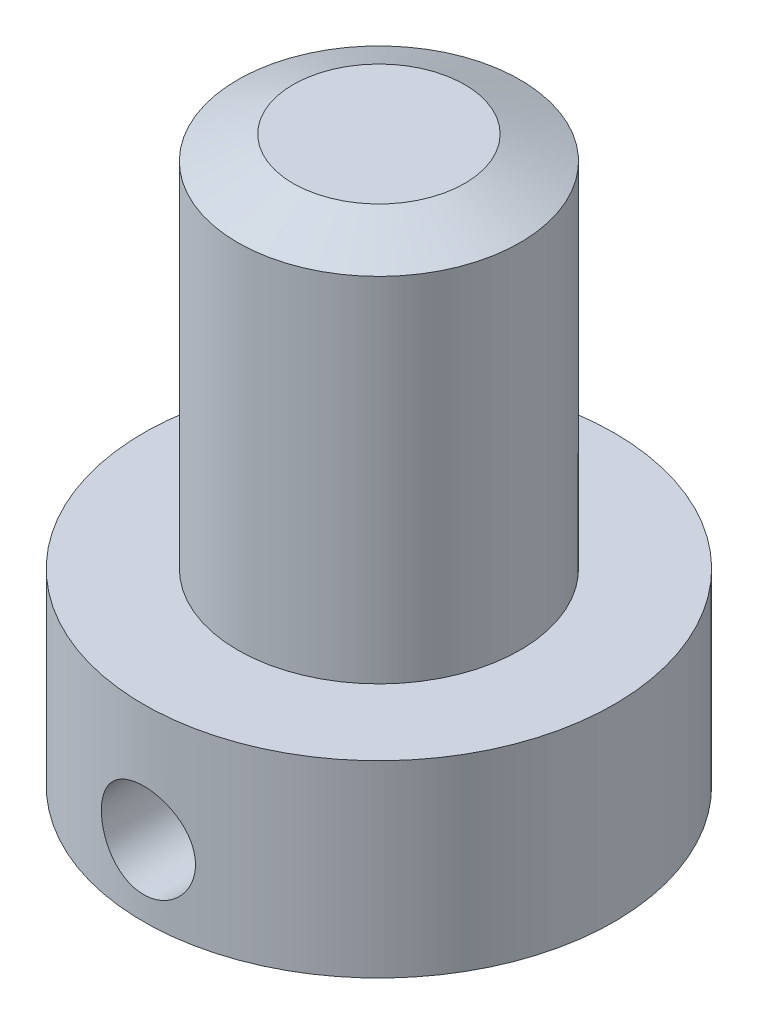
ISO-10303-21;
HEADER;
FILE_DESCRIPTION(('STEP AP214'),'2;1');
FILE_NAME('part.step','',(''),(''),'','','');
FILE_SCHEMA(('AUTOMOTIVE_DESIGN { 1 0 10303 214 1 1 1 1 }'));
ENDSEC;
DATA;
#1=APPLICATION_CONTEXT('core data for automotive mechanical design processes');
#2=APPLICATION_PROTOCOL_DEFINITION('international standard','automotive_design',2000,#1);
#3=PRODUCT_CONTEXT('',#1,'mechanical');
#4=PRODUCT('Part','Part','',(#3));
#5=PRODUCT_RELATED_PRODUCT_CATEGORY('part','',(#4));
#6=PRODUCT_DEFINITION_FORMATION('','',#4);
#7=PRODUCT_DEFINITION_CONTEXT('part definition',#1,'design');
#8=PRODUCT_DEFINITION('design','',#6,#7);
#9=PRODUCT_DEFINITION_SHAPE('','',#8);
#10=(LENGTH_UNIT() NAMED_UNIT(*) SI_UNIT(.MILLI.,.METRE.));
#11=(NAMED_UNIT(*) PLANE_ANGLE_UNIT() SI_UNIT($,.RADIAN.));
#12=(NAMED_UNIT(*) SI_UNIT($,.STERADIAN.) SOLID_ANGLE_UNIT());
#13=UNCERTAINTY_MEASURE_WITH_UNIT(LENGTH_MEASURE(1.E-05),#10,'distance_accuracy_value','');
#14=(GEOMETRIC_REPRESENTATION_CONTEXT(3) GLOBAL_UNCERTAINTY_ASSIGNED_CONTEXT((#13)) GLOBAL_UNIT_ASSIGNED_CONTEXT((#10,
#11,#12)) REPRESENTATION_CONTEXT('',''));
#15=CARTESIAN_POINT('',(0.,0.,0.));
#16=DIRECTION('',(0.,0.,1.));
#17=DIRECTION('',(1.,0.,0.));
#18=AXIS2_PLACEMENT_3D('',#15,#16,#17);
#19=CARTESIAN_POINT('',(0.,8.,0.));
#20=DIRECTION('',(0.,-1.,0.));
#21=DIRECTION('',(0.,0.,-1.));
#22=AXIS2_PLACEMENT_3D('',#19,#20,#21);
#23=CYLINDRICAL_SURFACE('',#22,3.);
#24=CARTESIAN_POINT('',(0.,7.5,0.));
#25=DIRECTION('',(0.,1.,0.));
#26=DIRECTION('',(0.,0.,1.));
#27=AXIS2_PLACEMENT_3D('',#24,#25,#26);
#28=CIRCLE('',#27,3.);
#29=CARTESIAN_POINT('',(0.,7.5,3.));
#30=VERTEX_POINT('',#29);
#31=EDGE_CURVE('E10',#30,#30,#28,.F.);
#32=ORIENTED_EDGE('',*,*,#31,.T.);
#33=EDGE_LOOP('',(#32));
#34=FACE_BOUND('',#33,.T.);
#35=CARTESIAN_POINT('',(0.,0.,0.));
#36=DIRECTION('',(0.,1.,0.));
#37=DIRECTION('',(0.,0.,1.));
#38=AXIS2_PLACEMENT_3D('',#35,#36,#37);
#39=CIRCLE('',#38,3.);
#40=CARTESIAN_POINT('',(0.,0.,3.));
#41=VERTEX_POINT('',#40);
#42=EDGE_CURVE('E119',#41,#41,#39,.T.);
#43=ORIENTED_EDGE('',*,*,#42,.T.);
#44=EDGE_LOOP('',(#43));
#45=FACE_BOUND('',#44,.T.);
#46=ADVANCED_FACE('F34',(#34,#45),#23,.T.);
#47=CARTESIAN_POINT('',(0.,8.,0.));
#48=DIRECTION('',(0.,1.,0.));
#49=DIRECTION('',(0.,0.,1.));
#50=AXIS2_PLACEMENT_3D('',#47,#48,#49);
#51=PLANE('',#50);
#52=CARTESIAN_POINT('',(0.,8.,0.));
#53=DIRECTION('',(0.,1.,0.));
#54=DIRECTION('',(0.,0.,1.));
#55=AXIS2_PLACEMENT_3D('',#52,#53,#54);
#56=CIRCLE('',#55,1.82207381708812);
#57=CARTESIAN_POINT('',(0.,8.,1.82207381708812));
#58=VERTEX_POINT('',#57);
#59=EDGE_CURVE('E45',#58,#58,#56,.T.);
#60=ORIENTED_EDGE('',*,*,#59,.T.);
#61=EDGE_LOOP('',(#60));
#62=FACE_BOUND('',#61,.T.);
#63=ADVANCED_FACE('F89',(#62),#51,.T.);
#64=CARTESIAN_POINT('',(0.,-5.,0.));
#65=DIRECTION('',(0.,1.,0.));
#66=DIRECTION('',(0.,0.,1.));
#67=AXIS2_PLACEMENT_3D('',#64,#65,#66);
#68=CYLINDRICAL_SURFACE('',#67,5.);
#69=CARTESIAN_POINT('',(0.,-4.,0.));
#70=DIRECTION('',(0.,-1.,0.));
#71=DIRECTION('',(0.,0.,-1.));
#72=AXIS2_PLACEMENT_3D('',#69,#70,#71);
#73=CIRCLE('',#72,5.);
#74=CARTESIAN_POINT('',(0.,-4.,-5.));
#75=VERTEX_POINT('',#74);
#76=EDGE_CURVE('E46',#75,#75,#73,.F.);
#77=ORIENTED_EDGE('',*,*,#76,.T.);
#78=EDGE_LOOP('',(#77));
#79=FACE_BOUND('',#78,.T.);
#80=CARTESIAN_POINT('',(0.,-1.5,-5.));
#81=CARTESIAN_POINT('',(-0.0555769067926332,-1.50000204449835,-4.99999897580871));
#82=CARTESIAN_POINT('',(-0.111179660201522,-1.50464884296765,-4.99906385178231));
#83=CARTESIAN_POINT('',(-0.220813507689019,-1.52309850011525,-4.99542365623231));
#84=CARTESIAN_POINT('',(-0.274843317541356,-1.53690863280151,-4.99271717860186));
#85=CARTESIAN_POINT('',(-0.379730305263313,-1.57324127362079,-4.98583649278287));
#86=CARTESIAN_POINT('',(-0.430590467933134,-1.59575543684469,-4.98166369076718));
#87=CARTESIAN_POINT('',(-0.527807988864225,-1.64883224751129,-4.97230398035314));
#88=CARTESIAN_POINT('',(-0.574165615075812,-1.67939441560721,-4.96711713235707));
#89=CARTESIAN_POINT('',(-0.661693477314865,-1.74813849429143,-4.9562216532997));
#90=CARTESIAN_POINT('',(-0.702793951158524,-1.7864083553912,-4.95050745504347));
#91=CARTESIAN_POINT('',(-0.778036756608028,-1.8692924163917,-4.93924180452588));
#92=CARTESIAN_POINT('',(-0.812178544770425,-1.91390711133512,-4.93369036500424));
#93=CARTESIAN_POINT('',(-0.87283175334762,-2.00871619301188,-4.92332441812615));
#94=CARTESIAN_POINT('',(-0.899270938865866,-2.05895764379636,-4.91851707364946));
#95=CARTESIAN_POINT('',(-0.943305666580308,-2.16328181900408,-4.91026268058418));
#96=CARTESIAN_POINT('',(-0.960902082437238,-2.21736416334634,-4.90681549761962));
#97=CARTESIAN_POINT('',(-0.986525299884827,-2.32708436390792,-4.90172805252204));
#98=CARTESIAN_POINT('',(-0.994674497958777,-2.38269254414223,-4.90006470107188));
#99=CARTESIAN_POINT('',(-1.00155212772612,-2.49450982136434,-4.89866375060627));
#100=CARTESIAN_POINT('',(-1.0002815227135,-2.55071885632014,-4.89892595467841));
#101=CARTESIAN_POINT('',(-0.988454573101819,-2.661246788021,-4.90132551148185));
#102=CARTESIAN_POINT('',(-0.978038540243905,-2.71558140562731,-4.90343452858763));
#103=CARTESIAN_POINT('',(-0.94843788462305,-2.821716076663,-4.90924546160001));
#104=CARTESIAN_POINT('',(-0.929252843100681,-2.87351600891901,-4.91294745357779));
#105=CARTESIAN_POINT('',(-0.88252478367472,-2.9735152617036,-4.92155618500408));
#106=CARTESIAN_POINT('',(-0.854926151232115,-3.02168787956917,-4.92647089813704));
#107=CARTESIAN_POINT('',(-0.792193574572679,-3.11277084997281,-4.93694618773062));
#108=CARTESIAN_POINT('',(-0.757058764356829,-3.15568059685116,-4.94250683838366));
#109=CARTESIAN_POINT('',(-0.679499934560584,-3.23582940245694,-4.95377021241462));
#110=CARTESIAN_POINT('',(-0.636956161212445,-3.27295256785913,-4.95947369210905));
#111=CARTESIAN_POINT('',(-0.54618502406201,-3.33955384630122,-4.97028848714408));
#112=CARTESIAN_POINT('',(-0.497957587379389,-3.36903186129358,-4.97539979488974));
#113=CARTESIAN_POINT('',(-0.397059386878921,-3.41952750922597,-4.98446690160887));
#114=CARTESIAN_POINT('',(-0.3443818195853,-3.44053189364454,-4.98842088848272));
#115=CARTESIAN_POINT('',(-0.236148976448665,-3.47336047403857,-4.99471408987858));
#116=CARTESIAN_POINT('',(-0.180594050072449,-3.48518578207363,-4.99705350000531));
#117=CARTESIAN_POINT('',(-0.0691794056271502,-3.49915645379428,-4.99982671866868));
#118=CARTESIAN_POINT('',(-0.0133403283255759,-3.50146041954027,-5.0002917465247));
#119=CARTESIAN_POINT('',(0.0979249341927142,-3.49675014105782,-4.99935051930103));
#120=CARTESIAN_POINT('',(0.153351142443793,-3.4897364206474,-4.99794436941446));
#121=CARTESIAN_POINT('',(0.261705659946541,-3.46672162645604,-4.99343832008018));
#122=CARTESIAN_POINT('',(0.314651948339903,-3.4508019315021,-4.99035376404206));
#123=CARTESIAN_POINT('',(0.417123627499667,-3.41051601734419,-4.98283552061033));
#124=CARTESIAN_POINT('',(0.466648761637539,-3.38614916532317,-4.97840173214227));
#125=CARTESIAN_POINT('',(0.561541173686217,-3.32931750934869,-4.96859911533294));
#126=CARTESIAN_POINT('',(0.606850126752188,-3.29675721896105,-4.96321950437052));
#127=CARTESIAN_POINT('',(0.691418019119207,-3.22459080879272,-4.95214734829882));
#128=CARTESIAN_POINT('',(0.730676308930762,-3.18498393360013,-4.94645476968388));
#129=CARTESIAN_POINT('',(0.802640590774176,-3.09912664810888,-4.93529303556965));
#130=CARTESIAN_POINT('',(0.835237702448655,-3.05278425577866,-4.92982860233304));
#131=CARTESIAN_POINT('',(0.892185420051205,-2.95518863864332,-4.91984191796194));
#132=CARTESIAN_POINT('',(0.916536355922903,-2.90393561042645,-4.91531962913342));
#133=CARTESIAN_POINT('',(0.95615184158196,-2.79823175385045,-4.90776740584383));
#134=CARTESIAN_POINT('',(0.971463499791051,-2.74379915878968,-4.90472974872187));
#135=CARTESIAN_POINT('',(0.992708651627196,-2.6330665465091,-4.90047436792025));
#136=CARTESIAN_POINT('',(0.998643368225112,-2.57676677379065,-4.89925640691111));
#137=CARTESIAN_POINT('',(1.00092091086747,-2.46499113545568,-4.89879149631379));
#138=CARTESIAN_POINT('',(0.997435788070896,-2.40951885107299,-4.89950919189301));
#139=CARTESIAN_POINT('',(0.981352304100061,-2.29996835009497,-4.90275573484614));
#140=CARTESIAN_POINT('',(0.968754016129298,-2.2458901223052,-4.90528456767169));
#141=CARTESIAN_POINT('',(0.934878568498954,-2.14077228875946,-4.91185264219159));
#142=CARTESIAN_POINT('',(0.913622506717345,-2.08972563949758,-4.91588821018831));
#143=CARTESIAN_POINT('',(0.863054644601604,-1.99189627926556,-4.9250171497417));
#144=CARTESIAN_POINT('',(0.833742168774882,-1.94511392627486,-4.93011060998894));
#145=CARTESIAN_POINT('',(0.767305914786414,-1.85628442784969,-4.94088960523225));
#146=CARTESIAN_POINT('',(0.73005788723518,-1.8143312347324,-4.94658372909699));
#147=CARTESIAN_POINT('',(0.64906436901314,-1.73721379447083,-4.95786081871955));
#148=CARTESIAN_POINT('',(0.605317387153335,-1.70205110968273,-4.96344375863184));
#149=CARTESIAN_POINT('',(0.512017629088246,-1.63916535605355,-4.97393832387971));
#150=CARTESIAN_POINT('',(0.462408884429835,-1.61152399671997,-4.97884231219246));
#151=CARTESIAN_POINT('',(0.359166360940732,-1.56501387740341,-4.98735125085));
#152=CARTESIAN_POINT('',(0.305536260863126,-1.54613721046751,-4.99095737138616));
#153=CARTESIAN_POINT('',(0.209821488923779,-1.52134805195528,-4.99576372595371));
#154=CARTESIAN_POINT('',(0.168281664013784,-1.51335680629224,-4.99734303158452));
#155=CARTESIAN_POINT('',(0.0844995252100668,-1.50268208764164,-4.99946154139893));
#156=CARTESIAN_POINT('',(0.0422572337486189,-1.49999844549023,-5.00000077873155));
#157=CARTESIAN_POINT('',(0.,-1.5,-5.));
#158=B_SPLINE_CURVE_WITH_KNOTS('',3,(#80,#81,#82,#83,#84,#85,#86,#87,#88,#89,#90,#91,#92,#93,
#94,#95,#96,#97,#98,#99,#100,#101,#102,#103,#104,#105,#106,#107,#108,#109,#110,#111,#112,#113,
#114,#115,#116,#117,#118,#119,#120,#121,#122,#123,#124,#125,#126,#127,#128,#129,#130,#131,#132,
#133,#134,#135,#136,#137,#138,#139,#140,#141,#142,#143,#144,#145,#146,#147,#148,#149,#150,#151,
#152,#153,#154,#155,#156,#157),.UNSPECIFIED.,.T.,.F.,(4,2,2,2,2,2,2,2,2,2,2,2,2,2,2,2,2,2,2,2,2,
2,2,2,2,2,2,2,2,2,2,2,2,2,2,2,2,2,4),(0.,0.166576130661258,0.333284650691323,0.499833735250341,
0.666372902230863,0.834932670112186,1.00350559674737,1.17361195005923,1.34370149365197,
1.51156185103587,1.67940504281225,1.84471727006278,2.0100373925373,2.17647490203593,
2.3429315474967,2.51238252491351,2.6818356753982,2.85155274854024,3.02124925698036,
3.18810735676265,3.35495607657868,3.52030453950723,3.68566539216022,3.85305066033359,
4.0204538834593,4.19040628579226,4.36035188723466,4.52940381032723,4.69843368330415,
4.86439722567701,5.03035943492608,5.1959196125311,5.36149367581867,5.52988076239143,
5.6983065453293,5.86849496675637,6.03852955517519,6.16518775289894,6.29184191370996),.UNSPECIFIED.);
#159=CARTESIAN_POINT('',(0.,-1.5,-5.));
#160=VERTEX_POINT('',#159);
#161=EDGE_CURVE('E54',#160,#160,#158,.T.);
#162=ORIENTED_EDGE('',*,*,#161,.T.);
#163=EDGE_LOOP('',(#162));
#164=FACE_BOUND('',#163,.T.);
#165=CARTESIAN_POINT('',(0.,-3.5,5.));
#166=CARTESIAN_POINT('',(-0.0555769067926332,-3.49999795550165,4.99999897580871));
#167=CARTESIAN_POINT('',(-0.111179660201522,-3.49535115703235,4.99906385178231));
#168=CARTESIAN_POINT('',(-0.220813507689019,-3.47690149988475,4.99542365623231));
#169=CARTESIAN_POINT('',(-0.274843317541356,-3.46309136719849,4.99271717860186));
#170=CARTESIAN_POINT('',(-0.379730305263313,-3.42675872637921,4.98583649278287));
#171=CARTESIAN_POINT('',(-0.430590467933134,-3.40424456315531,4.98166369076718));
#172=CARTESIAN_POINT('',(-0.527807988864225,-3.35116775248871,4.97230398035314));
#173=CARTESIAN_POINT('',(-0.574165615075812,-3.3206055843928,4.96711713235707));
#174=CARTESIAN_POINT('',(-0.661693477314865,-3.25186150570857,4.9562216532997));
#175=CARTESIAN_POINT('',(-0.702793951158524,-3.2135916446088,4.95050745504347));
#176=CARTESIAN_POINT('',(-0.778036756608028,-3.1307075836083,4.93924180452588));
#177=CARTESIAN_POINT('',(-0.812178544770424,-3.08609288866488,4.93369036500424));
#178=CARTESIAN_POINT('',(-0.87283175334762,-2.99128380698813,4.92332441812615));
#179=CARTESIAN_POINT('',(-0.899270938865866,-2.94104235620364,4.91851707364946));
#180=CARTESIAN_POINT('',(-0.943305666580308,-2.83671818099592,4.91026268058418));
#181=CARTESIAN_POINT('',(-0.960902082437238,-2.78263583665366,4.90681549761962));
#182=CARTESIAN_POINT('',(-0.986525299884827,-2.67291563609208,4.90172805252204));
#183=CARTESIAN_POINT('',(-0.994674497958777,-2.61730745585777,4.90006470107188));
#184=CARTESIAN_POINT('',(-1.00155212772612,-2.50549017863566,4.89866375060627));
#185=CARTESIAN_POINT('',(-1.0002815227135,-2.44928114367986,4.89892595467841));
#186=CARTESIAN_POINT('',(-0.988454573101819,-2.338753211979,4.90132551148185));
#187=CARTESIAN_POINT('',(-0.978038540243905,-2.28441859437269,4.90343452858763));
#188=CARTESIAN_POINT('',(-0.948437884623051,-2.178283923337,4.90924546160001));
#189=CARTESIAN_POINT('',(-0.929252843100681,-2.12648399108099,4.91294745357779));
#190=CARTESIAN_POINT('',(-0.88252478367472,-2.0264847382964,4.92155618500408));
#191=CARTESIAN_POINT('',(-0.854926151232115,-1.97831212043083,4.92647089813704));
#192=CARTESIAN_POINT('',(-0.792193574572679,-1.88722915002719,4.93694618773062));
#193=CARTESIAN_POINT('',(-0.757058764356829,-1.84431940314884,4.94250683838366));
#194=CARTESIAN_POINT('',(-0.679499934560584,-1.76417059754306,4.95377021241462));
#195=CARTESIAN_POINT('',(-0.636956161212445,-1.72704743214087,4.95947369210905));
#196=CARTESIAN_POINT('',(-0.54618502406201,-1.66044615369878,4.97028848714408));
#197=CARTESIAN_POINT('',(-0.49795758737939,-1.63096813870642,4.97539979488974));
#198=CARTESIAN_POINT('',(-0.397059386878921,-1.58047249077403,4.98446690160887));
#199=CARTESIAN_POINT('',(-0.3443818195853,-1.55946810635546,4.98842088848272));
#200=CARTESIAN_POINT('',(-0.236148976448665,-1.52663952596143,4.99471408987858));
#201=CARTESIAN_POINT('',(-0.18059405007245,-1.51481421792637,4.99705350000531));
#202=CARTESIAN_POINT('',(-0.0691794056271505,-1.50084354620572,4.99982671866868));
#203=CARTESIAN_POINT('',(-0.0133403283255763,-1.49853958045973,5.0002917465247));
#204=CARTESIAN_POINT('',(0.097924934192714,-1.50324985894218,4.99935051930103));
#205=CARTESIAN_POINT('',(0.153351142443793,-1.5102635793526,4.99794436941446));
#206=CARTESIAN_POINT('',(0.261705659946541,-1.53327837354396,4.99343832008018));
#207=CARTESIAN_POINT('',(0.314651948339903,-1.5491980684979,4.99035376404206));
#208=CARTESIAN_POINT('',(0.417123627499667,-1.58948398265581,4.98283552061033));
#209=CARTESIAN_POINT('',(0.466648761637539,-1.61385083467683,4.97840173214227));
#210=CARTESIAN_POINT('',(0.561541173686217,-1.67068249065131,4.96859911533294));
#211=CARTESIAN_POINT('',(0.606850126752188,-1.70324278103895,4.96321950437052));
#212=CARTESIAN_POINT('',(0.691418019119207,-1.77540919120728,4.95214734829882));
#213=CARTESIAN_POINT('',(0.730676308930762,-1.81501606639987,4.94645476968388));
#214=CARTESIAN_POINT('',(0.802640590774176,-1.90087335189112,4.93529303556965));
#215=CARTESIAN_POINT('',(0.835237702448655,-1.94721574422134,4.92982860233304));
#216=CARTESIAN_POINT('',(0.892185420051205,-2.04481136135668,4.91984191796194));
#217=CARTESIAN_POINT('',(0.916536355922902,-2.09606438957355,4.91531962913342));
#218=CARTESIAN_POINT('',(0.95615184158196,-2.20176824614955,4.90776740584383));
#219=CARTESIAN_POINT('',(0.971463499791051,-2.25620084121032,4.90472974872187));
#220=CARTESIAN_POINT('',(0.992708651627196,-2.3669334534909,4.90047436792025));
#221=CARTESIAN_POINT('',(0.998643368225112,-2.42323322620935,4.89925640691111));
#222=CARTESIAN_POINT('',(1.00092091086747,-2.53500886454432,4.89879149631379));
#223=CARTESIAN_POINT('',(0.997435788070896,-2.59048114892701,4.89950919189301));
#224=CARTESIAN_POINT('',(0.981352304100061,-2.70003164990503,4.90275573484614));
#225=CARTESIAN_POINT('',(0.968754016129298,-2.7541098776948,4.90528456767169));
#226=CARTESIAN_POINT('',(0.934878568498954,-2.85922771124054,4.91185264219159));
#227=CARTESIAN_POINT('',(0.913622506717345,-2.91027436050242,4.91588821018831));
#228=CARTESIAN_POINT('',(0.863054644601604,-3.00810372073444,4.9250171497417));
#229=CARTESIAN_POINT('',(0.833742168774882,-3.05488607372514,4.93011060998894));
#230=CARTESIAN_POINT('',(0.767305914786414,-3.14371557215031,4.94088960523225));
#231=CARTESIAN_POINT('',(0.730057887235181,-3.1856687652676,4.94658372909699));
#232=CARTESIAN_POINT('',(0.649064369013141,-3.26278620552917,4.95786081871955));
#233=CARTESIAN_POINT('',(0.605317387153335,-3.29794889031727,4.96344375863184));
#234=CARTESIAN_POINT('',(0.512017629088247,-3.36083464394645,4.97393832387971));
#235=CARTESIAN_POINT('',(0.462408884429835,-3.38847600328003,4.97884231219246));
#236=CARTESIAN_POINT('',(0.359166360940733,-3.43498612259659,4.98735125085));
#237=CARTESIAN_POINT('',(0.305536260863126,-3.45386278953249,4.99095737138616));
#238=CARTESIAN_POINT('',(0.209821488923779,-3.47865194804472,4.99576372595371));
#239=CARTESIAN_POINT('',(0.168281664013785,-3.48664319370776,4.99734303158452));
#240=CARTESIAN_POINT('',(0.084499525210067,-3.49731791235836,4.99946154139893));
#241=CARTESIAN_POINT('',(0.042257233748619,-3.50000155450977,5.00000077873155));
#242=CARTESIAN_POINT('',(0.,-3.5,5.));
#243=B_SPLINE_CURVE_WITH_KNOTS('',3,(#165,#166,#167,#168,#169,#170,#171,#172,#173,#174,#175,
#176,#177,#178,#179,#180,#181,#182,#183,#184,#185,#186,#187,#188,#189,#190,#191,#192,#193,#194,
#195,#196,#197,#198,#199,#200,#201,#202,#203,#204,#205,#206,#207,#208,#209,#210,#211,#212,#213,
#214,#215,#216,#217,#218,#219,#220,#221,#222,#223,#224,#225,#226,#227,#228,#229,#230,#231,#232,
#233,#234,#235,#236,#237,#238,#239,#240,#241,#242),.UNSPECIFIED.,.T.,.F.,(4,2,2,2,2,2,2,2,2,2,2,
2,2,2,2,2,2,2,2,2,2,2,2,2,2,2,2,2,2,2,2,2,2,2,2,2,2,2,4),(0.,0.166576130661258,
0.333284650691323,0.499833735250341,0.666372902230863,0.834932670112185,1.00350559674736,
1.17361195005923,1.34370149365197,1.51156185103587,1.67940504281225,1.84471727006278,
2.0100373925373,2.17647490203593,2.3429315474967,2.51238252491351,2.6818356753982,
2.85155274854024,3.02124925698036,3.18810735676265,3.35495607657868,3.52030453950723,
3.68566539216022,3.85305066033359,4.0204538834593,4.19040628579226,4.36035188723466,
4.52940381032723,4.69843368330415,4.86439722567701,5.03035943492608,5.1959196125311,
5.36149367581867,5.52988076239143,5.6983065453293,5.86849496675637,6.03852955517519,
6.16518775289894,6.29184191370996),.UNSPECIFIED.);
#244=CARTESIAN_POINT('',(0.,-3.5,5.));
#245=VERTEX_POINT('',#244);
#246=EDGE_CURVE('E65',#245,#245,#243,.T.);
#247=ORIENTED_EDGE('',*,*,#246,.T.);
#248=EDGE_LOOP('',(#247));
#249=FACE_BOUND('',#248,.T.);
#250=CARTESIAN_POINT('',(0.,0.,0.));
#251=DIRECTION('',(0.,-1.,0.));
#252=DIRECTION('',(0.,0.,-1.));
#253=AXIS2_PLACEMENT_3D('',#250,#251,#252);
#254=CIRCLE('',#253,5.);
#255=CARTESIAN_POINT('',(0.,0.,-5.));
#256=VERTEX_POINT('',#255);
#257=EDGE_CURVE('E113',#256,#256,#254,.T.);
#258=ORIENTED_EDGE('',*,*,#257,.T.);
#259=EDGE_LOOP('',(#258));
#260=FACE_BOUND('',#259,.T.);
#261=ADVANCED_FACE('F70',(#79,#164,#249,#260),#68,.T.);
#262=CARTESIAN_POINT('',(0.,-5.,0.));
#263=DIRECTION('',(0.,-1.,0.));
#264=DIRECTION('',(0.,0.,-1.));
#265=AXIS2_PLACEMENT_3D('',#262,#263,#264);
#266=PLANE('',#265);
#267=CARTESIAN_POINT('',(0.,-5.,0.));
#268=DIRECTION('',(0.,-1.,0.));
#269=DIRECTION('',(0.,0.,-1.));
#270=AXIS2_PLACEMENT_3D('',#267,#268,#269);
#271=CIRCLE('',#270,2.64414763417625);
#272=CARTESIAN_POINT('',(0.,-5.,-2.64414763417625));
#273=VERTEX_POINT('',#272);
#274=EDGE_CURVE('E49',#273,#273,#271,.T.);
#275=ORIENTED_EDGE('',*,*,#274,.T.);
#276=EDGE_LOOP('',(#275));
#277=FACE_BOUND('',#276,.T.);
#278=ADVANCED_FACE('F78',(#277),#266,.T.);
#279=CARTESIAN_POINT('',(0.,0.,0.));
#280=DIRECTION('',(0.,-1.,0.));
#281=DIRECTION('',(0.,0.,-1.));
#282=AXIS2_PLACEMENT_3D('',#279,#280,#281);
#283=PLANE('',#282);
#284=ORIENTED_EDGE('',*,*,#42,.F.);
#285=EDGE_LOOP('',(#284));
#286=FACE_BOUND('',#285,.T.);
#287=ORIENTED_EDGE('',*,*,#257,.F.);
#288=EDGE_LOOP('',(#287));
#289=FACE_BOUND('',#288,.T.);
#290=ADVANCED_FACE('F76',(#286,#289),#283,.F.);
#291=CARTESIAN_POINT('',(0.,-2.5,-5.));
#292=DIRECTION('',(0.,0.,1.));
#293=DIRECTION('',(1.,0.,0.));
#294=AXIS2_PLACEMENT_3D('',#291,#292,#293);
#295=CYLINDRICAL_SURFACE('',#294,1.);
#296=ORIENTED_EDGE('',*,*,#161,.F.);
#297=EDGE_LOOP('',(#296));
#298=FACE_BOUND('',#297,.T.);
#299=ORIENTED_EDGE('',*,*,#246,.F.);
#300=EDGE_LOOP('',(#299));
#301=FACE_BOUND('',#300,.T.);
#302=ADVANCED_FACE('F75',(#298,#301),#295,.F.);
#303=CARTESIAN_POINT('',(0.,-5.,0.));
#304=DIRECTION('',(0.,1.,0.));
#305=DIRECTION('',(0.,0.,1.));
#306=AXIS2_PLACEMENT_3D('',#303,#304,#305);
#307=CONICAL_SURFACE('',#306,2.64414763417625,1.1693705988362);
#308=ORIENTED_EDGE('',*,*,#76,.F.);
#309=EDGE_LOOP('',(#308));
#310=FACE_BOUND('',#309,.T.);
#311=ORIENTED_EDGE('',*,*,#274,.F.);
#312=EDGE_LOOP('',(#311));
#313=FACE_BOUND('',#312,.T.);
#314=ADVANCED_FACE('F79',(#310,#313),#307,.T.);
#315=CARTESIAN_POINT('',(0.,8.,0.));
#316=DIRECTION('',(0.,-1.,0.));
#317=DIRECTION('',(0.,0.,-1.));
#318=AXIS2_PLACEMENT_3D('',#315,#316,#317);
#319=CONICAL_SURFACE('',#318,1.82207381708812,1.1693705988362);
#320=ORIENTED_EDGE('',*,*,#31,.F.);
#321=EDGE_LOOP('',(#320));
#322=FACE_BOUND('',#321,.T.);
#323=ORIENTED_EDGE('',*,*,#59,.F.);
#324=EDGE_LOOP('',(#323));
#325=FACE_BOUND('',#324,.T.);
#326=ADVANCED_FACE('F40',(#322,#325),#319,.T.);
#327=CLOSED_SHELL('',(#46,#63,#261,#278,#290,#302,#314,#326));
#328=MANIFOLD_SOLID_BREP('B2',#327);
#329=ADVANCED_BREP_SHAPE_REPRESENTATION('',(#18,#328),#14);
#330=SHAPE_DEFINITION_REPRESENTATION(#9,#329);
ENDSEC;
END-ISO-10303-21;
